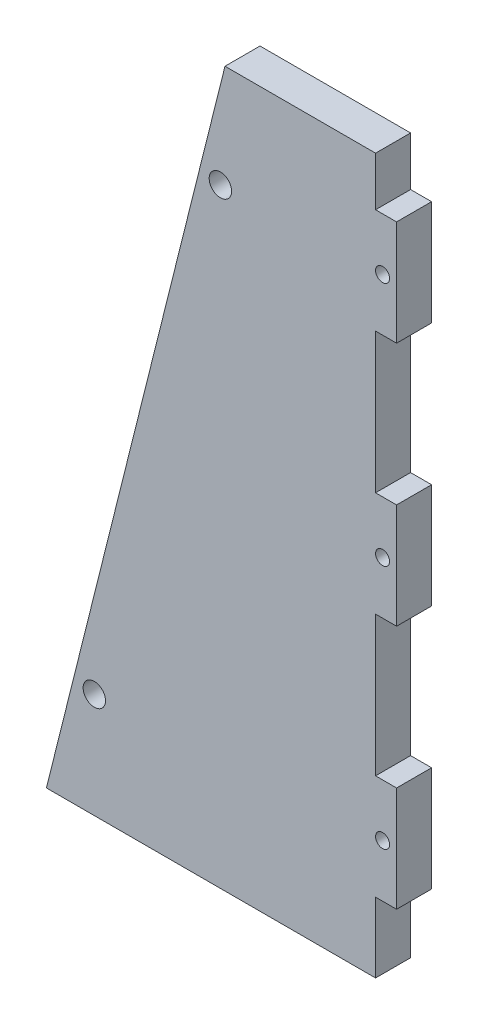
ISO-10303-21;
HEADER;
FILE_DESCRIPTION(('STEP AP214'),'2;1');
FILE_NAME('part.step','',(''),(''),'','','');
FILE_SCHEMA(('AUTOMOTIVE_DESIGN { 1 0 10303 214 1 1 1 1 }'));
ENDSEC;
DATA;
#1=APPLICATION_CONTEXT('core data for automotive mechanical design processes');
#2=APPLICATION_PROTOCOL_DEFINITION('international standard','automotive_design',2000,#1);
#3=PRODUCT_CONTEXT('',#1,'mechanical');
#4=PRODUCT('Part','Part','',(#3));
#5=PRODUCT_RELATED_PRODUCT_CATEGORY('part','',(#4));
#6=PRODUCT_DEFINITION_FORMATION('','',#4);
#7=PRODUCT_DEFINITION_CONTEXT('part definition',#1,'design');
#8=PRODUCT_DEFINITION('design','',#6,#7);
#9=PRODUCT_DEFINITION_SHAPE('','',#8);
#10=(LENGTH_UNIT() NAMED_UNIT(*) SI_UNIT(.MILLI.,.METRE.));
#11=(NAMED_UNIT(*) PLANE_ANGLE_UNIT() SI_UNIT($,.RADIAN.));
#12=(NAMED_UNIT(*) SI_UNIT($,.STERADIAN.) SOLID_ANGLE_UNIT());
#13=UNCERTAINTY_MEASURE_WITH_UNIT(LENGTH_MEASURE(1.E-05),#10,'distance_accuracy_value','');
#14=(GEOMETRIC_REPRESENTATION_CONTEXT(3) GLOBAL_UNCERTAINTY_ASSIGNED_CONTEXT((#13)) GLOBAL_UNIT_ASSIGNED_CONTEXT((#10,
#11,#12)) REPRESENTATION_CONTEXT('',''));
#15=CARTESIAN_POINT('',(0.,0.,0.));
#16=DIRECTION('',(0.,0.,1.));
#17=DIRECTION('',(1.,0.,0.));
#18=AXIS2_PLACEMENT_3D('',#15,#16,#17);
#19=CARTESIAN_POINT('',(0.,0.,5.));
#20=DIRECTION('',(-1.,0.,0.));
#21=DIRECTION('',(0.,0.,1.));
#22=AXIS2_PLACEMENT_3D('',#19,#20,#21);
#23=PLANE('',#22);
#24=DIRECTION('',(0.,1.,0.));
#25=VECTOR('',#24,1.);
#26=CARTESIAN_POINT('',(0.,0.,5.));
#27=LINE('',#26,#25);
#28=CARTESIAN_POINT('',(0.,10.,5.));
#29=VERTEX_POINT('',#28);
#30=CARTESIAN_POINT('',(0.,25.,5.));
#31=VERTEX_POINT('',#30);
#32=EDGE_CURVE('E304',#29,#31,#27,.T.);
#33=ORIENTED_EDGE('',*,*,#32,.F.);
#34=DIRECTION('',(0.,0.,1.));
#35=VECTOR('',#34,1.);
#36=CARTESIAN_POINT('',(0.,10.,0.));
#37=LINE('',#36,#35);
#38=CARTESIAN_POINT('',(0.,10.,0.));
#39=VERTEX_POINT('',#38);
#40=EDGE_CURVE('E194',#39,#29,#37,.T.);
#41=ORIENTED_EDGE('',*,*,#40,.F.);
#42=DIRECTION('',(0.,1.,0.));
#43=VECTOR('',#42,1.);
#44=CARTESIAN_POINT('',(0.,0.,0.));
#45=LINE('',#44,#43);
#46=CARTESIAN_POINT('',(0.,25.,0.));
#47=VERTEX_POINT('',#46);
#48=EDGE_CURVE('E316',#39,#47,#45,.T.);
#49=ORIENTED_EDGE('',*,*,#48,.T.);
#50=DIRECTION('',(0.,0.,1.));
#51=VECTOR('',#50,1.);
#52=CARTESIAN_POINT('',(0.,25.,0.));
#53=LINE('',#52,#51);
#54=EDGE_CURVE('E199',#47,#31,#53,.T.);
#55=ORIENTED_EDGE('',*,*,#54,.T.);
#56=EDGE_LOOP('',(#33,#41,#49,#55));
#57=FACE_BOUND('',#56,.T.);
#58=ADVANCED_FACE('F38',(#57),#23,.F.);
#59=CARTESIAN_POINT('',(0.,45.,5.));
#60=VERTEX_POINT('',#59);
#61=CARTESIAN_POINT('',(0.,60.,5.));
#62=VERTEX_POINT('',#61);
#63=EDGE_CURVE('E303',#60,#62,#27,.T.);
#64=ORIENTED_EDGE('',*,*,#63,.F.);
#65=DIRECTION('',(0.,0.,1.));
#66=VECTOR('',#65,1.);
#67=CARTESIAN_POINT('',(0.,45.,0.));
#68=LINE('',#67,#66);
#69=CARTESIAN_POINT('',(0.,45.,0.));
#70=VERTEX_POINT('',#69);
#71=EDGE_CURVE('E223',#70,#60,#68,.T.);
#72=ORIENTED_EDGE('',*,*,#71,.F.);
#73=CARTESIAN_POINT('',(0.,60.,0.));
#74=VERTEX_POINT('',#73);
#75=EDGE_CURVE('E315',#70,#74,#45,.T.);
#76=ORIENTED_EDGE('',*,*,#75,.T.);
#77=DIRECTION('',(0.,0.,1.));
#78=VECTOR('',#77,1.);
#79=CARTESIAN_POINT('',(0.,60.,0.));
#80=LINE('',#79,#78);
#81=EDGE_CURVE('E229',#74,#62,#80,.T.);
#82=ORIENTED_EDGE('',*,*,#81,.T.);
#83=EDGE_LOOP('',(#64,#72,#76,#82));
#84=FACE_BOUND('',#83,.T.);
#85=ADVANCED_FACE('F347',(#84),#23,.F.);
#86=CARTESIAN_POINT('',(-50.,0.,5.));
#87=DIRECTION('',(0.,1.,0.));
#88=DIRECTION('',(0.,0.,1.));
#89=AXIS2_PLACEMENT_3D('',#86,#87,#88);
#90=PLANE('',#89);
#91=DIRECTION('',(1.,0.,0.));
#92=VECTOR('',#91,1.);
#93=CARTESIAN_POINT('',(-50.,0.,0.));
#94=LINE('',#93,#92);
#95=CARTESIAN_POINT('',(-50.,0.,0.));
#96=VERTEX_POINT('',#95);
#97=CARTESIAN_POINT('',(-3.,0.,0.));
#98=VERTEX_POINT('',#97);
#99=EDGE_CURVE('E206',#96,#98,#94,.T.);
#100=ORIENTED_EDGE('',*,*,#99,.T.);
#101=DIRECTION('',(0.,0.,1.));
#102=VECTOR('',#101,1.);
#103=CARTESIAN_POINT('',(-3.,0.,0.));
#104=LINE('',#103,#102);
#105=CARTESIAN_POINT('',(-3.,0.,5.));
#106=VERTEX_POINT('',#105);
#107=EDGE_CURVE('E202',#98,#106,#104,.T.);
#108=ORIENTED_EDGE('',*,*,#107,.T.);
#109=DIRECTION('',(1.,0.,0.));
#110=VECTOR('',#109,1.);
#111=CARTESIAN_POINT('',(-50.,0.,5.));
#112=LINE('',#111,#110);
#113=CARTESIAN_POINT('',(-50.,0.,5.));
#114=VERTEX_POINT('',#113);
#115=EDGE_CURVE('E295',#114,#106,#112,.T.);
#116=ORIENTED_EDGE('',*,*,#115,.F.);
#117=DIRECTION('',(0.,0.,-1.));
#118=VECTOR('',#117,1.);
#119=CARTESIAN_POINT('',(-50.,0.,5.));
#120=LINE('',#119,#118);
#121=EDGE_CURVE('E47',#114,#96,#120,.T.);
#122=ORIENTED_EDGE('',*,*,#121,.T.);
#123=EDGE_LOOP('',(#100,#108,#116,#122));
#124=FACE_BOUND('',#123,.T.);
#125=ADVANCED_FACE('F40',(#124),#90,.F.);
#126=CARTESIAN_POINT('',(0.,80.,5.));
#127=VERTEX_POINT('',#126);
#128=CARTESIAN_POINT('',(0.,95.,5.));
#129=VERTEX_POINT('',#128);
#130=EDGE_CURVE('E299',#127,#129,#27,.T.);
#131=ORIENTED_EDGE('',*,*,#130,.F.);
#132=DIRECTION('',(0.,0.,1.));
#133=VECTOR('',#132,1.);
#134=CARTESIAN_POINT('',(0.,80.,0.));
#135=LINE('',#134,#133);
#136=CARTESIAN_POINT('',(0.,80.,0.));
#137=VERTEX_POINT('',#136);
#138=EDGE_CURVE('E259',#137,#127,#135,.T.);
#139=ORIENTED_EDGE('',*,*,#138,.F.);
#140=CARTESIAN_POINT('',(0.,95.,0.));
#141=VERTEX_POINT('',#140);
#142=EDGE_CURVE('E311',#137,#141,#45,.T.);
#143=ORIENTED_EDGE('',*,*,#142,.T.);
#144=DIRECTION('',(0.,0.,1.));
#145=VECTOR('',#144,1.);
#146=CARTESIAN_POINT('',(0.,95.,0.));
#147=LINE('',#146,#145);
#148=EDGE_CURVE('E265',#141,#129,#147,.T.);
#149=ORIENTED_EDGE('',*,*,#148,.T.);
#150=EDGE_LOOP('',(#131,#139,#143,#149));
#151=FACE_BOUND('',#150,.T.);
#152=ADVANCED_FACE('F364',(#151),#23,.F.);
#153=CARTESIAN_POINT('',(-25.,100.,5.));
#154=DIRECTION('',(0.970142500145332,-0.242535625036333,0.));
#155=DIRECTION('',(0.242535625036333,0.970142500145332,0.));
#156=AXIS2_PLACEMENT_3D('',#153,#154,#155);
#157=PLANE('',#156);
#158=DIRECTION('',(-0.242535625036333,-0.970142500145332,0.));
#159=VECTOR('',#158,1.);
#160=CARTESIAN_POINT('',(-25.,100.,0.));
#161=LINE('',#160,#159);
#162=CARTESIAN_POINT('',(-24.5,102.,0.));
#163=VERTEX_POINT('',#162);
#164=EDGE_CURVE('E174',#163,#96,#161,.T.);
#165=ORIENTED_EDGE('',*,*,#164,.T.);
#166=ORIENTED_EDGE('',*,*,#121,.F.);
#167=DIRECTION('',(-0.242535625036333,-0.970142500145332,0.));
#168=VECTOR('',#167,1.);
#169=CARTESIAN_POINT('',(-25.,100.,5.));
#170=LINE('',#169,#168);
#171=CARTESIAN_POINT('',(-24.5,102.,5.));
#172=VERTEX_POINT('',#171);
#173=EDGE_CURVE('E305',#172,#114,#170,.T.);
#174=ORIENTED_EDGE('',*,*,#173,.F.);
#175=DIRECTION('',(0.,0.,1.));
#176=VECTOR('',#175,1.);
#177=CARTESIAN_POINT('',(-24.5,102.,0.));
#178=LINE('',#177,#176);
#179=EDGE_CURVE('E169',#163,#172,#178,.T.);
#180=ORIENTED_EDGE('',*,*,#179,.F.);
#181=EDGE_LOOP('',(#165,#166,#174,#180));
#182=FACE_BOUND('',#181,.T.);
#183=ADVANCED_FACE('F367',(#182),#157,.F.);
#184=CARTESIAN_POINT('',(0.,0.,5.));
#185=DIRECTION('',(0.,0.,1.));
#186=DIRECTION('',(1.,0.,0.));
#187=AXIS2_PLACEMENT_3D('',#184,#185,#186);
#188=PLANE('',#187);
#189=CARTESIAN_POINT('',(-2.,87.5,5.));
#190=DIRECTION('',(0.,0.,1.));
#191=DIRECTION('',(1.,0.,0.));
#192=AXIS2_PLACEMENT_3D('',#189,#190,#191);
#193=CIRCLE('',#192,1.);
#194=CARTESIAN_POINT('',(-0.999999999999999,87.5,5.));
#195=VERTEX_POINT('',#194);
#196=EDGE_CURVE('E560',#195,#195,#193,.T.);
#197=ORIENTED_EDGE('',*,*,#196,.F.);
#198=EDGE_LOOP('',(#197));
#199=FACE_BOUND('',#198,.T.);
#200=CARTESIAN_POINT('',(-2.,52.5,5.));
#201=DIRECTION('',(0.,0.,1.));
#202=DIRECTION('',(1.,0.,0.));
#203=AXIS2_PLACEMENT_3D('',#200,#201,#202);
#204=CIRCLE('',#203,1.);
#205=CARTESIAN_POINT('',(-1.,52.5,5.));
#206=VERTEX_POINT('',#205);
#207=EDGE_CURVE('E568',#206,#206,#204,.T.);
#208=ORIENTED_EDGE('',*,*,#207,.F.);
#209=EDGE_LOOP('',(#208));
#210=FACE_BOUND('',#209,.T.);
#211=CARTESIAN_POINT('',(-2.,17.5,5.));
#212=DIRECTION('',(0.,0.,1.));
#213=DIRECTION('',(1.,0.,0.));
#214=AXIS2_PLACEMENT_3D('',#211,#212,#213);
#215=CIRCLE('',#214,1.);
#216=CARTESIAN_POINT('',(-1.,17.5,5.));
#217=VERTEX_POINT('',#216);
#218=EDGE_CURVE('E578',#217,#217,#215,.T.);
#219=ORIENTED_EDGE('',*,*,#218,.F.);
#220=EDGE_LOOP('',(#219));
#221=FACE_BOUND('',#220,.T.);
#222=CARTESIAN_POINT('',(-25.1576707807868,87.,5.));
#223=DIRECTION('',(0.,0.,1.));
#224=DIRECTION('',(1.,0.,0.));
#225=AXIS2_PLACEMENT_3D('',#222,#223,#224);
#226=CIRCLE('',#225,1.60000000000001);
#227=CARTESIAN_POINT('',(-23.5576707807868,87.,5.));
#228=VERTEX_POINT('',#227);
#229=EDGE_CURVE('E585',#228,#228,#226,.T.);
#230=ORIENTED_EDGE('',*,*,#229,.F.);
#231=EDGE_LOOP('',(#230));
#232=FACE_BOUND('',#231,.T.);
#233=CARTESIAN_POINT('',(-43.1576707807868,15.,5.));
#234=DIRECTION('',(0.,0.,1.));
#235=DIRECTION('',(1.,0.,0.));
#236=AXIS2_PLACEMENT_3D('',#233,#234,#235);
#237=CIRCLE('',#236,1.6);
#238=CARTESIAN_POINT('',(-41.5576707807868,15.,5.));
#239=VERTEX_POINT('',#238);
#240=EDGE_CURVE('E182',#239,#239,#237,.T.);
#241=ORIENTED_EDGE('',*,*,#240,.F.);
#242=EDGE_LOOP('',(#241));
#243=FACE_BOUND('',#242,.T.);
#244=DIRECTION('',(0.,-1.,0.));
#245=VECTOR('',#244,1.);
#246=CARTESIAN_POINT('',(-3.,0.,5.));
#247=LINE('',#246,#245);
#248=CARTESIAN_POINT('',(-3.,10.,5.));
#249=VERTEX_POINT('',#248);
#250=EDGE_CURVE('E191',#249,#106,#247,.T.);
#251=ORIENTED_EDGE('',*,*,#250,.F.);
#252=DIRECTION('',(-1.,0.,0.));
#253=VECTOR('',#252,1.);
#254=CARTESIAN_POINT('',(0.,10.,5.));
#255=LINE('',#254,#253);
#256=EDGE_CURVE('E195',#29,#249,#255,.T.);
#257=ORIENTED_EDGE('',*,*,#256,.F.);
#258=ORIENTED_EDGE('',*,*,#32,.T.);
#259=DIRECTION('',(1.,0.,0.));
#260=VECTOR('',#259,1.);
#261=CARTESIAN_POINT('',(0.,25.,5.));
#262=LINE('',#261,#260);
#263=CARTESIAN_POINT('',(-3.,25.,5.));
#264=VERTEX_POINT('',#263);
#265=EDGE_CURVE('E216',#264,#31,#262,.T.);
#266=ORIENTED_EDGE('',*,*,#265,.F.);
#267=DIRECTION('',(0.,-1.,0.));
#268=VECTOR('',#267,1.);
#269=CARTESIAN_POINT('',(-3.,25.,5.));
#270=LINE('',#269,#268);
#271=CARTESIAN_POINT('',(-3.,45.,5.));
#272=VERTEX_POINT('',#271);
#273=EDGE_CURVE('E228',#272,#264,#270,.T.);
#274=ORIENTED_EDGE('',*,*,#273,.F.);
#275=DIRECTION('',(-1.,0.,0.));
#276=VECTOR('',#275,1.);
#277=CARTESIAN_POINT('',(0.,45.,5.));
#278=LINE('',#277,#276);
#279=EDGE_CURVE('E224',#60,#272,#278,.T.);
#280=ORIENTED_EDGE('',*,*,#279,.F.);
#281=ORIENTED_EDGE('',*,*,#63,.T.);
#282=DIRECTION('',(1.,0.,0.));
#283=VECTOR('',#282,1.);
#284=CARTESIAN_POINT('',(0.,60.,5.));
#285=LINE('',#284,#283);
#286=CARTESIAN_POINT('',(-3.,60.,5.));
#287=VERTEX_POINT('',#286);
#288=EDGE_CURVE('E251',#287,#62,#285,.T.);
#289=ORIENTED_EDGE('',*,*,#288,.F.);
#290=DIRECTION('',(0.,-1.,0.));
#291=VECTOR('',#290,1.);
#292=CARTESIAN_POINT('',(-3.,60.,5.));
#293=LINE('',#292,#291);
#294=CARTESIAN_POINT('',(-3.,80.,5.));
#295=VERTEX_POINT('',#294);
#296=EDGE_CURVE('E264',#295,#287,#293,.T.);
#297=ORIENTED_EDGE('',*,*,#296,.F.);
#298=DIRECTION('',(-1.,0.,0.));
#299=VECTOR('',#298,1.);
#300=CARTESIAN_POINT('',(0.,80.,5.));
#301=LINE('',#300,#299);
#302=EDGE_CURVE('E260',#127,#295,#301,.T.);
#303=ORIENTED_EDGE('',*,*,#302,.F.);
#304=ORIENTED_EDGE('',*,*,#130,.T.);
#305=DIRECTION('',(1.,0.,0.));
#306=VECTOR('',#305,1.);
#307=CARTESIAN_POINT('',(0.,95.,5.));
#308=LINE('',#307,#306);
#309=CARTESIAN_POINT('',(-3.,95.,5.));
#310=VERTEX_POINT('',#309);
#311=EDGE_CURVE('E285',#310,#129,#308,.T.);
#312=ORIENTED_EDGE('',*,*,#311,.F.);
#313=DIRECTION('',(0.,-1.,0.));
#314=VECTOR('',#313,1.);
#315=CARTESIAN_POINT('',(-3.,95.,5.));
#316=LINE('',#315,#314);
#317=CARTESIAN_POINT('',(-3.,102.,5.));
#318=VERTEX_POINT('',#317);
#319=EDGE_CURVE('E186',#318,#310,#316,.T.);
#320=ORIENTED_EDGE('',*,*,#319,.F.);
#321=DIRECTION('',(-1.,0.,0.));
#322=VECTOR('',#321,1.);
#323=CARTESIAN_POINT('',(-24.5,102.,5.));
#324=LINE('',#323,#322);
#325=EDGE_CURVE('E167',#318,#172,#324,.T.);
#326=ORIENTED_EDGE('',*,*,#325,.T.);
#327=ORIENTED_EDGE('',*,*,#173,.T.);
#328=ORIENTED_EDGE('',*,*,#115,.T.);
#329=EDGE_LOOP('',(#251,#257,#258,#266,#274,#280,#281,#289,#297,#303,#304,#312,#320,#326,#327,#328));
#330=FACE_BOUND('',#329,.T.);
#331=ADVANCED_FACE('F342',(#199,#210,#221,#232,#243,#330),#188,.T.);
#332=CARTESIAN_POINT('',(0.,0.,0.));
#333=DIRECTION('',(0.,0.,1.));
#334=DIRECTION('',(1.,0.,0.));
#335=AXIS2_PLACEMENT_3D('',#332,#333,#334);
#336=PLANE('',#335);
#337=CARTESIAN_POINT('',(-2.,87.5,0.));
#338=DIRECTION('',(0.,0.,1.));
#339=DIRECTION('',(1.,0.,0.));
#340=AXIS2_PLACEMENT_3D('',#337,#338,#339);
#341=CIRCLE('',#340,1.);
#342=CARTESIAN_POINT('',(-0.999999999999999,87.5,0.));
#343=VERTEX_POINT('',#342);
#344=EDGE_CURVE('E557',#343,#343,#341,.T.);
#345=ORIENTED_EDGE('',*,*,#344,.T.);
#346=EDGE_LOOP('',(#345));
#347=FACE_BOUND('',#346,.T.);
#348=CARTESIAN_POINT('',(-2.,52.5,0.));
#349=DIRECTION('',(0.,0.,1.));
#350=DIRECTION('',(1.,0.,0.));
#351=AXIS2_PLACEMENT_3D('',#348,#349,#350);
#352=CIRCLE('',#351,1.);
#353=CARTESIAN_POINT('',(-1.,52.5,0.));
#354=VERTEX_POINT('',#353);
#355=EDGE_CURVE('E562',#354,#354,#352,.T.);
#356=ORIENTED_EDGE('',*,*,#355,.T.);
#357=EDGE_LOOP('',(#356));
#358=FACE_BOUND('',#357,.T.);
#359=CARTESIAN_POINT('',(-2.,17.5,0.));
#360=DIRECTION('',(0.,0.,1.));
#361=DIRECTION('',(1.,0.,0.));
#362=AXIS2_PLACEMENT_3D('',#359,#360,#361);
#363=CIRCLE('',#362,1.);
#364=CARTESIAN_POINT('',(-1.,17.5,0.));
#365=VERTEX_POINT('',#364);
#366=EDGE_CURVE('E574',#365,#365,#363,.T.);
#367=ORIENTED_EDGE('',*,*,#366,.T.);
#368=EDGE_LOOP('',(#367));
#369=FACE_BOUND('',#368,.T.);
#370=CARTESIAN_POINT('',(-25.1576707807868,87.,0.));
#371=DIRECTION('',(0.,0.,1.));
#372=DIRECTION('',(1.,0.,0.));
#373=AXIS2_PLACEMENT_3D('',#370,#371,#372);
#374=CIRCLE('',#373,1.60000000000001);
#375=CARTESIAN_POINT('',(-23.5576707807868,87.,0.));
#376=VERTEX_POINT('',#375);
#377=EDGE_CURVE('E179',#376,#376,#374,.T.);
#378=ORIENTED_EDGE('',*,*,#377,.T.);
#379=EDGE_LOOP('',(#378));
#380=FACE_BOUND('',#379,.T.);
#381=CARTESIAN_POINT('',(-43.1576707807868,15.,0.));
#382=DIRECTION('',(0.,0.,1.));
#383=DIRECTION('',(1.,0.,0.));
#384=AXIS2_PLACEMENT_3D('',#381,#382,#383);
#385=CIRCLE('',#384,1.6);
#386=CARTESIAN_POINT('',(-41.5576707807868,15.,0.));
#387=VERTEX_POINT('',#386);
#388=EDGE_CURVE('E588',#387,#387,#385,.T.);
#389=ORIENTED_EDGE('',*,*,#388,.T.);
#390=EDGE_LOOP('',(#389));
#391=FACE_BOUND('',#390,.T.);
#392=DIRECTION('',(-1.,0.,0.));
#393=VECTOR('',#392,1.);
#394=CARTESIAN_POINT('',(0.,10.,0.));
#395=LINE('',#394,#393);
#396=CARTESIAN_POINT('',(-3.,10.,0.));
#397=VERTEX_POINT('',#396);
#398=EDGE_CURVE('E188',#39,#397,#395,.T.);
#399=ORIENTED_EDGE('',*,*,#398,.T.);
#400=DIRECTION('',(0.,-1.,0.));
#401=VECTOR('',#400,1.);
#402=CARTESIAN_POINT('',(-3.,0.,0.));
#403=LINE('',#402,#401);
#404=EDGE_CURVE('E54',#397,#98,#403,.T.);
#405=ORIENTED_EDGE('',*,*,#404,.T.);
#406=ORIENTED_EDGE('',*,*,#99,.F.);
#407=ORIENTED_EDGE('',*,*,#164,.F.);
#408=DIRECTION('',(-1.,0.,0.));
#409=VECTOR('',#408,1.);
#410=CARTESIAN_POINT('',(-24.5,102.,0.));
#411=LINE('',#410,#409);
#412=CARTESIAN_POINT('',(-3.,102.,0.));
#413=VERTEX_POINT('',#412);
#414=EDGE_CURVE('E165',#413,#163,#411,.T.);
#415=ORIENTED_EDGE('',*,*,#414,.F.);
#416=DIRECTION('',(0.,-1.,0.));
#417=VECTOR('',#416,1.);
#418=CARTESIAN_POINT('',(-3.,0.,0.));
#419=LINE('',#418,#417);
#420=CARTESIAN_POINT('',(-3.,95.,0.));
#421=VERTEX_POINT('',#420);
#422=EDGE_CURVE('E11',#413,#421,#419,.T.);
#423=ORIENTED_EDGE('',*,*,#422,.T.);
#424=DIRECTION('',(1.,0.,0.));
#425=VECTOR('',#424,1.);
#426=CARTESIAN_POINT('',(0.,95.,0.));
#427=LINE('',#426,#425);
#428=EDGE_CURVE('E282',#421,#141,#427,.T.);
#429=ORIENTED_EDGE('',*,*,#428,.T.);
#430=ORIENTED_EDGE('',*,*,#142,.F.);
#431=DIRECTION('',(-1.,0.,0.));
#432=VECTOR('',#431,1.);
#433=CARTESIAN_POINT('',(0.,80.,0.));
#434=LINE('',#433,#432);
#435=CARTESIAN_POINT('',(-3.,80.,0.));
#436=VERTEX_POINT('',#435);
#437=EDGE_CURVE('E246',#137,#436,#434,.T.);
#438=ORIENTED_EDGE('',*,*,#437,.T.);
#439=DIRECTION('',(0.,-1.,0.));
#440=VECTOR('',#439,1.);
#441=CARTESIAN_POINT('',(-3.,60.,0.));
#442=LINE('',#441,#440);
#443=CARTESIAN_POINT('',(-3.,60.,0.));
#444=VERTEX_POINT('',#443);
#445=EDGE_CURVE('E250',#436,#444,#442,.T.);
#446=ORIENTED_EDGE('',*,*,#445,.T.);
#447=DIRECTION('',(1.,0.,0.));
#448=VECTOR('',#447,1.);
#449=CARTESIAN_POINT('',(0.,60.,0.));
#450=LINE('',#449,#448);
#451=EDGE_CURVE('E255',#444,#74,#450,.T.);
#452=ORIENTED_EDGE('',*,*,#451,.T.);
#453=ORIENTED_EDGE('',*,*,#75,.F.);
#454=DIRECTION('',(-1.,0.,0.));
#455=VECTOR('',#454,1.);
#456=CARTESIAN_POINT('',(0.,45.,0.));
#457=LINE('',#456,#455);
#458=CARTESIAN_POINT('',(-3.,45.,0.));
#459=VERTEX_POINT('',#458);
#460=EDGE_CURVE('E212',#70,#459,#457,.T.);
#461=ORIENTED_EDGE('',*,*,#460,.T.);
#462=DIRECTION('',(0.,-1.,0.));
#463=VECTOR('',#462,1.);
#464=CARTESIAN_POINT('',(-3.,25.,0.));
#465=LINE('',#464,#463);
#466=CARTESIAN_POINT('',(-3.,25.,0.));
#467=VERTEX_POINT('',#466);
#468=EDGE_CURVE('E62',#459,#467,#465,.T.);
#469=ORIENTED_EDGE('',*,*,#468,.T.);
#470=DIRECTION('',(1.,0.,0.));
#471=VECTOR('',#470,1.);
#472=CARTESIAN_POINT('',(0.,25.,0.));
#473=LINE('',#472,#471);
#474=EDGE_CURVE('E219',#467,#47,#473,.T.);
#475=ORIENTED_EDGE('',*,*,#474,.T.);
#476=ORIENTED_EDGE('',*,*,#48,.F.);
#477=EDGE_LOOP('',(#399,#405,#406,#407,#415,#423,#429,#430,#438,#446,#452,#453,#461,#469,#475,#476));
#478=FACE_BOUND('',#477,.T.);
#479=ADVANCED_FACE('F172',(#347,#358,#369,#380,#391,#478),#336,.F.);
#480=CARTESIAN_POINT('',(-3.,95.,0.));
#481=DIRECTION('',(-1.,0.,0.));
#482=DIRECTION('',(0.,0.,1.));
#483=AXIS2_PLACEMENT_3D('',#480,#481,#482);
#484=PLANE('',#483);
#485=ORIENTED_EDGE('',*,*,#319,.T.);
#486=DIRECTION('',(0.,0.,1.));
#487=VECTOR('',#486,1.);
#488=CARTESIAN_POINT('',(-3.,95.,0.));
#489=LINE('',#488,#487);
#490=EDGE_CURVE('E157',#421,#310,#489,.T.);
#491=ORIENTED_EDGE('',*,*,#490,.F.);
#492=ORIENTED_EDGE('',*,*,#422,.F.);
#493=DIRECTION('',(0.,0.,1.));
#494=VECTOR('',#493,1.);
#495=CARTESIAN_POINT('',(-3.,102.,0.));
#496=LINE('',#495,#494);
#497=EDGE_CURVE('E154',#413,#318,#496,.T.);
#498=ORIENTED_EDGE('',*,*,#497,.T.);
#499=EDGE_LOOP('',(#485,#491,#492,#498));
#500=FACE_BOUND('',#499,.T.);
#501=ADVANCED_FACE('F153',(#500),#484,.F.);
#502=CARTESIAN_POINT('',(0.,95.,0.));
#503=DIRECTION('',(0.,-1.,0.));
#504=DIRECTION('',(0.,0.,-1.));
#505=AXIS2_PLACEMENT_3D('',#502,#503,#504);
#506=PLANE('',#505);
#507=ORIENTED_EDGE('',*,*,#311,.T.);
#508=ORIENTED_EDGE('',*,*,#148,.F.);
#509=ORIENTED_EDGE('',*,*,#428,.F.);
#510=ORIENTED_EDGE('',*,*,#490,.T.);
#511=EDGE_LOOP('',(#507,#508,#509,#510));
#512=FACE_BOUND('',#511,.T.);
#513=ADVANCED_FACE('F366',(#512),#506,.F.);
#514=CARTESIAN_POINT('',(0.,60.,0.));
#515=DIRECTION('',(0.,-1.,0.));
#516=DIRECTION('',(0.,0.,-1.));
#517=AXIS2_PLACEMENT_3D('',#514,#515,#516);
#518=PLANE('',#517);
#519=ORIENTED_EDGE('',*,*,#288,.T.);
#520=ORIENTED_EDGE('',*,*,#81,.F.);
#521=ORIENTED_EDGE('',*,*,#451,.F.);
#522=DIRECTION('',(0.,0.,1.));
#523=VECTOR('',#522,1.);
#524=CARTESIAN_POINT('',(-3.,60.,0.));
#525=LINE('',#524,#523);
#526=EDGE_CURVE('E274',#444,#287,#525,.T.);
#527=ORIENTED_EDGE('',*,*,#526,.T.);
#528=EDGE_LOOP('',(#519,#520,#521,#527));
#529=FACE_BOUND('',#528,.T.);
#530=ADVANCED_FACE('F352',(#529),#518,.F.);
#531=CARTESIAN_POINT('',(-3.,60.,0.));
#532=DIRECTION('',(-1.,0.,0.));
#533=DIRECTION('',(0.,-1.,0.));
#534=AXIS2_PLACEMENT_3D('',#531,#532,#533);
#535=PLANE('',#534);
#536=ORIENTED_EDGE('',*,*,#296,.T.);
#537=ORIENTED_EDGE('',*,*,#526,.F.);
#538=ORIENTED_EDGE('',*,*,#445,.F.);
#539=DIRECTION('',(0.,0.,1.));
#540=VECTOR('',#539,1.);
#541=CARTESIAN_POINT('',(-3.,80.,0.));
#542=LINE('',#541,#540);
#543=EDGE_CURVE('E277',#436,#295,#542,.T.);
#544=ORIENTED_EDGE('',*,*,#543,.T.);
#545=EDGE_LOOP('',(#536,#537,#538,#544));
#546=FACE_BOUND('',#545,.T.);
#547=ADVANCED_FACE('F356',(#546),#535,.F.);
#548=CARTESIAN_POINT('',(0.,80.,0.));
#549=DIRECTION('',(0.,1.,0.));
#550=DIRECTION('',(0.,0.,1.));
#551=AXIS2_PLACEMENT_3D('',#548,#549,#550);
#552=PLANE('',#551);
#553=ORIENTED_EDGE('',*,*,#302,.T.);
#554=ORIENTED_EDGE('',*,*,#543,.F.);
#555=ORIENTED_EDGE('',*,*,#437,.F.);
#556=ORIENTED_EDGE('',*,*,#138,.T.);
#557=EDGE_LOOP('',(#553,#554,#555,#556));
#558=FACE_BOUND('',#557,.T.);
#559=ADVANCED_FACE('F358',(#558),#552,.F.);
#560=CARTESIAN_POINT('',(0.,25.,0.));
#561=DIRECTION('',(0.,-1.,0.));
#562=DIRECTION('',(0.,0.,-1.));
#563=AXIS2_PLACEMENT_3D('',#560,#561,#562);
#564=PLANE('',#563);
#565=ORIENTED_EDGE('',*,*,#265,.T.);
#566=ORIENTED_EDGE('',*,*,#54,.F.);
#567=ORIENTED_EDGE('',*,*,#474,.F.);
#568=DIRECTION('',(0.,0.,1.));
#569=VECTOR('',#568,1.);
#570=CARTESIAN_POINT('',(-3.,25.,0.));
#571=LINE('',#570,#569);
#572=EDGE_CURVE('E238',#467,#264,#571,.T.);
#573=ORIENTED_EDGE('',*,*,#572,.T.);
#574=EDGE_LOOP('',(#565,#566,#567,#573));
#575=FACE_BOUND('',#574,.T.);
#576=ADVANCED_FACE('F427',(#575),#564,.F.);
#577=CARTESIAN_POINT('',(-3.,25.,0.));
#578=DIRECTION('',(-1.,0.,0.));
#579=DIRECTION('',(0.,-1.,0.));
#580=AXIS2_PLACEMENT_3D('',#577,#578,#579);
#581=PLANE('',#580);
#582=ORIENTED_EDGE('',*,*,#273,.T.);
#583=ORIENTED_EDGE('',*,*,#572,.F.);
#584=ORIENTED_EDGE('',*,*,#468,.F.);
#585=DIRECTION('',(0.,0.,1.));
#586=VECTOR('',#585,1.);
#587=CARTESIAN_POINT('',(-3.,45.,0.));
#588=LINE('',#587,#586);
#589=EDGE_CURVE('E241',#459,#272,#588,.T.);
#590=ORIENTED_EDGE('',*,*,#589,.T.);
#591=EDGE_LOOP('',(#582,#583,#584,#590));
#592=FACE_BOUND('',#591,.T.);
#593=ADVANCED_FACE('F436',(#592),#581,.F.);
#594=CARTESIAN_POINT('',(0.,45.,0.));
#595=DIRECTION('',(0.,1.,0.));
#596=DIRECTION('',(0.,0.,1.));
#597=AXIS2_PLACEMENT_3D('',#594,#595,#596);
#598=PLANE('',#597);
#599=ORIENTED_EDGE('',*,*,#279,.T.);
#600=ORIENTED_EDGE('',*,*,#589,.F.);
#601=ORIENTED_EDGE('',*,*,#460,.F.);
#602=ORIENTED_EDGE('',*,*,#71,.T.);
#603=EDGE_LOOP('',(#599,#600,#601,#602));
#604=FACE_BOUND('',#603,.T.);
#605=ADVANCED_FACE('F446',(#604),#598,.F.);
#606=CARTESIAN_POINT('',(-3.,0.,0.));
#607=DIRECTION('',(-1.,0.,0.));
#608=DIRECTION('',(0.,0.,1.));
#609=AXIS2_PLACEMENT_3D('',#606,#607,#608);
#610=PLANE('',#609);
#611=ORIENTED_EDGE('',*,*,#250,.T.);
#612=ORIENTED_EDGE('',*,*,#107,.F.);
#613=ORIENTED_EDGE('',*,*,#404,.F.);
#614=DIRECTION('',(0.,0.,1.));
#615=VECTOR('',#614,1.);
#616=CARTESIAN_POINT('',(-3.,10.,0.));
#617=LINE('',#616,#615);
#618=EDGE_CURVE('E207',#397,#249,#617,.T.);
#619=ORIENTED_EDGE('',*,*,#618,.T.);
#620=EDGE_LOOP('',(#611,#612,#613,#619));
#621=FACE_BOUND('',#620,.T.);
#622=ADVANCED_FACE('F455',(#621),#610,.F.);
#623=CARTESIAN_POINT('',(0.,10.,0.));
#624=DIRECTION('',(0.,1.,0.));
#625=DIRECTION('',(-1.,0.,0.));
#626=AXIS2_PLACEMENT_3D('',#623,#624,#625);
#627=PLANE('',#626);
#628=ORIENTED_EDGE('',*,*,#256,.T.);
#629=ORIENTED_EDGE('',*,*,#618,.F.);
#630=ORIENTED_EDGE('',*,*,#398,.F.);
#631=ORIENTED_EDGE('',*,*,#40,.T.);
#632=EDGE_LOOP('',(#628,#629,#630,#631));
#633=FACE_BOUND('',#632,.T.);
#634=ADVANCED_FACE('F328',(#633),#627,.F.);
#635=CARTESIAN_POINT('',(-24.5,102.,0.));
#636=DIRECTION('',(0.,1.,0.));
#637=DIRECTION('',(0.,0.,1.));
#638=AXIS2_PLACEMENT_3D('',#635,#636,#637);
#639=PLANE('',#638);
#640=ORIENTED_EDGE('',*,*,#325,.F.);
#641=ORIENTED_EDGE('',*,*,#497,.F.);
#642=ORIENTED_EDGE('',*,*,#414,.T.);
#643=ORIENTED_EDGE('',*,*,#179,.T.);
#644=EDGE_LOOP('',(#640,#641,#642,#643));
#645=FACE_BOUND('',#644,.T.);
#646=ADVANCED_FACE('F163',(#645),#639,.T.);
#647=CARTESIAN_POINT('',(-43.1576707807868,15.,0.));
#648=DIRECTION('',(0.,0.,1.));
#649=DIRECTION('',(1.,0.,0.));
#650=AXIS2_PLACEMENT_3D('',#647,#648,#649);
#651=CYLINDRICAL_SURFACE('',#650,1.6);
#652=ORIENTED_EDGE('',*,*,#388,.F.);
#653=EDGE_LOOP('',(#652));
#654=FACE_BOUND('',#653,.T.);
#655=ORIENTED_EDGE('',*,*,#240,.T.);
#656=EDGE_LOOP('',(#655));
#657=FACE_BOUND('',#656,.T.);
#658=ADVANCED_FACE('F495',(#654,#657),#651,.F.);
#659=CARTESIAN_POINT('',(-25.1576707807868,87.,0.));
#660=DIRECTION('',(0.,0.,1.));
#661=DIRECTION('',(1.,0.,0.));
#662=AXIS2_PLACEMENT_3D('',#659,#660,#661);
#663=CYLINDRICAL_SURFACE('',#662,1.60000000000001);
#664=ORIENTED_EDGE('',*,*,#377,.F.);
#665=EDGE_LOOP('',(#664));
#666=FACE_BOUND('',#665,.T.);
#667=ORIENTED_EDGE('',*,*,#229,.T.);
#668=EDGE_LOOP('',(#667));
#669=FACE_BOUND('',#668,.T.);
#670=ADVANCED_FACE('F504',(#666,#669),#663,.F.);
#671=CARTESIAN_POINT('',(-2.,17.5,0.));
#672=DIRECTION('',(0.,0.,1.));
#673=DIRECTION('',(1.,0.,0.));
#674=AXIS2_PLACEMENT_3D('',#671,#672,#673);
#675=CYLINDRICAL_SURFACE('',#674,1.);
#676=ORIENTED_EDGE('',*,*,#366,.F.);
#677=EDGE_LOOP('',(#676));
#678=FACE_BOUND('',#677,.T.);
#679=ORIENTED_EDGE('',*,*,#218,.T.);
#680=EDGE_LOOP('',(#679));
#681=FACE_BOUND('',#680,.T.);
#682=ADVANCED_FACE('F513',(#678,#681),#675,.F.);
#683=CARTESIAN_POINT('',(-2.,52.5,0.));
#684=DIRECTION('',(0.,0.,1.));
#685=DIRECTION('',(1.,0.,0.));
#686=AXIS2_PLACEMENT_3D('',#683,#684,#685);
#687=CYLINDRICAL_SURFACE('',#686,1.);
#688=ORIENTED_EDGE('',*,*,#355,.F.);
#689=EDGE_LOOP('',(#688));
#690=FACE_BOUND('',#689,.T.);
#691=ORIENTED_EDGE('',*,*,#207,.T.);
#692=EDGE_LOOP('',(#691));
#693=FACE_BOUND('',#692,.T.);
#694=ADVANCED_FACE('F530',(#690,#693),#687,.F.);
#695=CARTESIAN_POINT('',(-2.,87.5,0.));
#696=DIRECTION('',(0.,0.,1.));
#697=DIRECTION('',(1.,0.,0.));
#698=AXIS2_PLACEMENT_3D('',#695,#696,#697);
#699=CYLINDRICAL_SURFACE('',#698,1.);
#700=ORIENTED_EDGE('',*,*,#344,.F.);
#701=EDGE_LOOP('',(#700));
#702=FACE_BOUND('',#701,.T.);
#703=ORIENTED_EDGE('',*,*,#196,.T.);
#704=EDGE_LOOP('',(#703));
#705=FACE_BOUND('',#704,.T.);
#706=ADVANCED_FACE('F540',(#702,#705),#699,.F.);
#707=CLOSED_SHELL('',(#58,#85,#125,#152,#183,#331,#479,#501,#513,#530,#547,#559,#576,#593,#605,
#622,#634,#646,#658,#670,#682,#694,#706));
#708=MANIFOLD_SOLID_BREP('B2',#707);
#709=ADVANCED_BREP_SHAPE_REPRESENTATION('',(#18,#708),#14);
#710=SHAPE_DEFINITION_REPRESENTATION(#9,#709);
ENDSEC;
END-ISO-10303-21;
